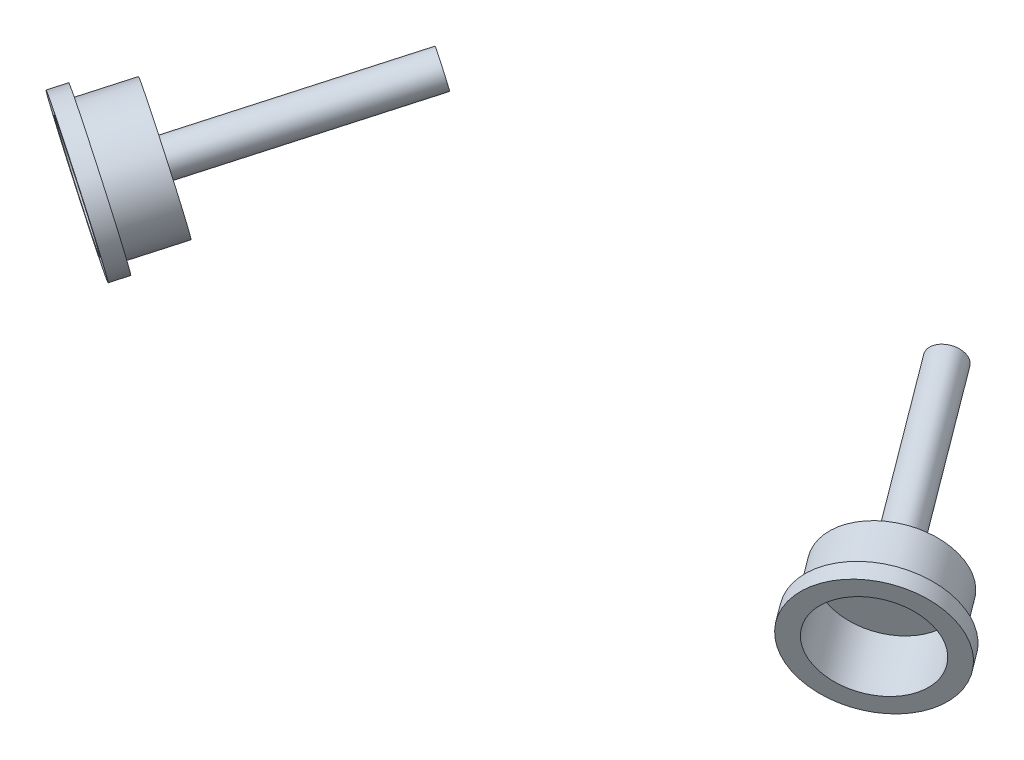
ISO-10303-21;
HEADER;
FILE_DESCRIPTION(('STEP AP214'),'2;1');
FILE_NAME('part.step','',(''),(''),'','','');
FILE_SCHEMA(('AUTOMOTIVE_DESIGN { 1 0 10303 214 1 1 1 1 }'));
ENDSEC;
DATA;
#1=APPLICATION_CONTEXT('core data for automotive mechanical design processes');
#2=APPLICATION_PROTOCOL_DEFINITION('international standard','automotive_design',2000,#1);
#3=PRODUCT_CONTEXT('',#1,'mechanical');
#4=PRODUCT('Part','Part','',(#3));
#5=PRODUCT_RELATED_PRODUCT_CATEGORY('part','',(#4));
#6=PRODUCT_DEFINITION_FORMATION('','',#4);
#7=PRODUCT_DEFINITION_CONTEXT('part definition',#1,'design');
#8=PRODUCT_DEFINITION('design','',#6,#7);
#9=PRODUCT_DEFINITION_SHAPE('','',#8);
#10=(LENGTH_UNIT() NAMED_UNIT(*) SI_UNIT(.MILLI.,.METRE.));
#11=(NAMED_UNIT(*) PLANE_ANGLE_UNIT() SI_UNIT($,.RADIAN.));
#12=(NAMED_UNIT(*) SI_UNIT($,.STERADIAN.) SOLID_ANGLE_UNIT());
#13=UNCERTAINTY_MEASURE_WITH_UNIT(LENGTH_MEASURE(1.E-05),#10,'distance_accuracy_value','');
#14=(GEOMETRIC_REPRESENTATION_CONTEXT(3) GLOBAL_UNCERTAINTY_ASSIGNED_CONTEXT((#13)) GLOBAL_UNIT_ASSIGNED_CONTEXT((#10,
#11,#12)) REPRESENTATION_CONTEXT('',''));
#15=CARTESIAN_POINT('',(0.,0.,0.));
#16=DIRECTION('',(0.,0.,1.));
#17=DIRECTION('',(1.,0.,0.));
#18=AXIS2_PLACEMENT_3D('',#15,#16,#17);
#19=CARTESIAN_POINT('',(7.09189110470637,-3.1747739557324,10.6212753890006));
#20=DIRECTION('',(0.538897500357627,-0.241244221560213,0.807087795516763));
#21=DIRECTION('',(-0.0886985432402282,0.936537053099896,0.339162080129877));
#22=AXIS2_PLACEMENT_3D('',#19,#20,#21);
#23=CYLINDRICAL_SURFACE('',#22,0.26);
#24=CARTESIAN_POINT('',(4.48901617797903,-2.00956436559657,6.72304133665464));
#25=DIRECTION('',(0.538897500357627,-0.241244221560213,0.807087795516763));
#26=DIRECTION('',(-0.0886985432402282,0.936537053099896,0.339162080129877));
#27=AXIS2_PLACEMENT_3D('',#24,#25,#26);
#28=CIRCLE('',#27,0.26);
#29=CARTESIAN_POINT('',(4.46595455673657,-1.7660647317906,6.8112234774884));
#30=VERTEX_POINT('',#29);
#31=EDGE_CURVE('P0_E10',#30,#30,#28,.T.);
#32=ORIENTED_EDGE('',*,*,#31,.F.);
#33=EDGE_LOOP('',(#32));
#34=FACE_BOUND('',#33,.T.);
#35=CARTESIAN_POINT('',(6.54221565434159,-2.92870484974099,9.79804583757351));
#36=DIRECTION('',(0.538897500357627,-0.241244221560213,0.807087795516763));
#37=DIRECTION('',(-0.0886985432402282,0.936537053099896,0.339162080129877));
#38=AXIS2_PLACEMENT_3D('',#35,#36,#37);
#39=CIRCLE('',#38,0.26);
#40=CARTESIAN_POINT('',(6.51915403309913,-2.68520521593501,9.88622797840727));
#41=VERTEX_POINT('',#40);
#42=EDGE_CURVE('P0_E49',#41,#41,#39,.T.);
#43=ORIENTED_EDGE('',*,*,#42,.T.);
#44=EDGE_LOOP('',(#43));
#45=FACE_BOUND('',#44,.T.);
#46=ADVANCED_FACE('P0_F15',(#34,#45),#23,.F.);
#47=CARTESIAN_POINT('',(4.51207779922149,-2.25306399940255,6.63485919582087));
#48=DIRECTION('',(0.538897500357627,-0.241244221560213,0.807087795516763));
#49=DIRECTION('',(-0.0886985432402282,0.936537053099896,0.339162080129877));
#50=AXIS2_PLACEMENT_3D('',#47,#48,#49);
#51=PLANE('',#50);
#52=CARTESIAN_POINT('',(4.48901617797903,-2.00956436559657,6.72304133665464));
#53=DIRECTION('',(0.538897500357627,-0.241244221560213,0.807087795516763));
#54=DIRECTION('',(-0.0886985432402282,0.936537053099896,0.339162080129877));
#55=AXIS2_PLACEMENT_3D('',#52,#53,#54);
#56=CIRCLE('',#55,0.3);
#57=CARTESIAN_POINT('',(4.46240661500696,-1.72860324966661,6.8247899606936));
#58=VERTEX_POINT('',#57);
#59=EDGE_CURVE('P0_E21',#58,#58,#56,.T.);
#60=ORIENTED_EDGE('',*,*,#59,.F.);
#61=EDGE_LOOP('',(#60));
#62=FACE_BOUND('',#61,.T.);
#63=ORIENTED_EDGE('',*,*,#31,.T.);
#64=EDGE_LOOP('',(#63));
#65=FACE_BOUND('',#64,.T.);
#66=ADVANCED_FACE('P0_F98',(#62,#65),#51,.F.);
#67=CARTESIAN_POINT('',(7.09189110470637,-3.1747739557324,10.6212753890006));
#68=DIRECTION('',(0.538897500357627,-0.241244221560213,0.807087795516763));
#69=DIRECTION('',(-0.0886985432402282,0.936537053099896,0.339162080129877));
#70=AXIS2_PLACEMENT_3D('',#67,#68,#69);
#71=CYLINDRICAL_SURFACE('',#70,0.3);
#72=CARTESIAN_POINT('',(6.46677000429152,-2.89493065872256,9.68505354620116));
#73=DIRECTION('',(0.538897500357627,-0.241244221560213,0.807087795516763));
#74=DIRECTION('',(-0.0886985432402282,0.936537053099896,0.339162080129877));
#75=AXIS2_PLACEMENT_3D('',#72,#73,#74);
#76=CIRCLE('',#75,0.3);
#77=CARTESIAN_POINT('',(6.44016044131945,-2.61396954279259,9.78680217024012));
#78=VERTEX_POINT('',#77);
#79=EDGE_CURVE('P0_E25',#78,#78,#76,.T.);
#80=ORIENTED_EDGE('',*,*,#79,.F.);
#81=EDGE_LOOP('',(#80));
#82=FACE_BOUND('',#81,.T.);
#83=ORIENTED_EDGE('',*,*,#59,.T.);
#84=EDGE_LOOP('',(#83));
#85=FACE_BOUND('',#84,.T.);
#86=ADVANCED_FACE('P0_F93',(#82,#85),#71,.T.);
#87=CARTESIAN_POINT('',(6.49337956726359,-3.17589177465252,9.5833049221622));
#88=DIRECTION('',(0.538897500357627,-0.241244221560213,0.807087795516763));
#89=DIRECTION('',(-0.0886985432402282,0.936537053099896,0.339162080129877));
#90=AXIS2_PLACEMENT_3D('',#87,#88,#89);
#91=PLANE('',#90);
#92=CARTESIAN_POINT('',(6.46677000429152,-2.89493065872256,9.68505354620116));
#93=DIRECTION('',(0.538897500357627,-0.241244221560213,0.807087795516763));
#94=DIRECTION('',(-0.0886985432402282,0.936537053099896,0.339162080129877));
#95=AXIS2_PLACEMENT_3D('',#92,#93,#94);
#96=CIRCLE('',#95,1.08);
#97=CARTESIAN_POINT('',(6.37097557759207,-1.88347064137467,10.0513485927414));
#98=VERTEX_POINT('',#97);
#99=EDGE_CURVE('P0_E29',#98,#98,#96,.T.);
#100=ORIENTED_EDGE('',*,*,#99,.F.);
#101=EDGE_LOOP('',(#100));
#102=FACE_BOUND('',#101,.T.);
#103=ORIENTED_EDGE('',*,*,#79,.T.);
#104=EDGE_LOOP('',(#103));
#105=FACE_BOUND('',#104,.T.);
#106=ADVANCED_FACE('P0_F87',(#102,#105),#91,.F.);
#107=CARTESIAN_POINT('',(7.09189110470637,-3.1747739557324,10.6212753890006));
#108=DIRECTION('',(0.538897500357627,-0.241244221560213,0.807087795516763));
#109=DIRECTION('',(-0.0886985432402282,0.936537053099896,0.339162080129877));
#110=AXIS2_PLACEMENT_3D('',#107,#108,#109);
#111=CYLINDRICAL_SURFACE('',#110,1.08);
#112=CARTESIAN_POINT('',(6.93022185459908,-3.10240068926434,10.3791490503456));
#113=DIRECTION('',(0.538897500357627,-0.241244221560213,0.807087795516763));
#114=DIRECTION('',(-0.0886985432402282,0.936537053099896,0.339162080129877));
#115=AXIS2_PLACEMENT_3D('',#112,#113,#114);
#116=CIRCLE('',#115,1.08);
#117=CARTESIAN_POINT('',(6.83442742789963,-2.09094067191645,10.7454440968858));
#118=VERTEX_POINT('',#117);
#119=EDGE_CURVE('P0_E34',#118,#118,#116,.T.);
#120=ORIENTED_EDGE('',*,*,#119,.F.);
#121=EDGE_LOOP('',(#120));
#122=FACE_BOUND('',#121,.T.);
#123=ORIENTED_EDGE('',*,*,#99,.T.);
#124=EDGE_LOOP('',(#123));
#125=FACE_BOUND('',#124,.T.);
#126=ADVANCED_FACE('P0_F81',(#122,#125),#111,.T.);
#127=CARTESIAN_POINT('',(7.02601628129853,-4.11386070661223,10.0128540038053));
#128=DIRECTION('',(0.538897500357627,-0.241244221560213,0.807087795516763));
#129=DIRECTION('',(-0.0886985432402282,0.936537053099896,0.339162080129877));
#130=AXIS2_PLACEMENT_3D('',#127,#128,#129);
#131=PLANE('',#130);
#132=CARTESIAN_POINT('',(6.93022185459908,-3.10240068926434,10.3791490503456));
#133=DIRECTION('',(0.538897500357627,-0.241244221560213,0.807087795516763));
#134=DIRECTION('',(-0.0886985432402282,0.936537053099896,0.339162080129877));
#135=AXIS2_PLACEMENT_3D('',#132,#133,#134);
#136=CIRCLE('',#135,1.275);
#137=CARTESIAN_POINT('',(6.81713121196779,-1.90831594656197,10.8115807025112));
#138=VERTEX_POINT('',#137);
#139=EDGE_CURVE('P0_E37',#138,#138,#136,.T.);
#140=ORIENTED_EDGE('',*,*,#139,.F.);
#141=EDGE_LOOP('',(#140));
#142=FACE_BOUND('',#141,.T.);
#143=ORIENTED_EDGE('',*,*,#119,.T.);
#144=EDGE_LOOP('',(#143));
#145=FACE_BOUND('',#144,.T.);
#146=ADVANCED_FACE('P0_F75',(#142,#145),#131,.F.);
#147=CARTESIAN_POINT('',(7.09189110470637,-3.1747739557324,10.6212753890006));
#148=DIRECTION('',(0.538897500357627,-0.241244221560213,0.807087795516763));
#149=DIRECTION('',(-0.0886985432402282,0.936537053099896,0.339162080129877));
#150=AXIS2_PLACEMENT_3D('',#147,#148,#149);
#151=CYLINDRICAL_SURFACE('',#150,1.275);
#152=CARTESIAN_POINT('',(7.09189110470637,-3.1747739557324,10.6212753890006));
#153=DIRECTION('',(0.538897500357627,-0.241244221560213,0.807087795516763));
#154=DIRECTION('',(-0.0886985432402282,0.936537053099896,0.339162080129877));
#155=AXIS2_PLACEMENT_3D('',#152,#153,#154);
#156=CIRCLE('',#155,1.275);
#157=CARTESIAN_POINT('',(6.97880046207508,-1.98068921303004,11.0537070411662));
#158=VERTEX_POINT('',#157);
#159=EDGE_CURVE('P0_E40',#158,#158,#156,.T.);
#160=ORIENTED_EDGE('',*,*,#159,.F.);
#161=EDGE_LOOP('',(#160));
#162=FACE_BOUND('',#161,.T.);
#163=ORIENTED_EDGE('',*,*,#139,.T.);
#164=EDGE_LOOP('',(#163));
#165=FACE_BOUND('',#164,.T.);
#166=ADVANCED_FACE('P0_F69',(#162,#165),#151,.T.);
#167=CARTESIAN_POINT('',(7.20498174733766,-4.36885869843477,10.188843736835));
#168=DIRECTION('',(-0.538897500357627,0.241244221560213,-0.807087795516763));
#169=DIRECTION('',(0.0886985432402282,-0.936537053099896,-0.339162080129877));
#170=AXIS2_PLACEMENT_3D('',#167,#168,#169);
#171=PLANE('',#170);
#172=CARTESIAN_POINT('',(7.09189110470637,-3.1747739557324,10.6212753890006));
#173=DIRECTION('',(0.538897500357627,-0.241244221560213,0.807087795516763));
#174=DIRECTION('',(-0.0886985432402282,0.936537053099896,0.339162080129877));
#175=AXIS2_PLACEMENT_3D('',#172,#173,#174);
#176=CIRCLE('',#175,0.945);
#177=CARTESIAN_POINT('',(7.00807098134435,-2.289746440553,10.9417835547233));
#178=VERTEX_POINT('',#177);
#179=EDGE_CURVE('P0_E43',#178,#178,#176,.T.);
#180=ORIENTED_EDGE('',*,*,#179,.F.);
#181=EDGE_LOOP('',(#180));
#182=FACE_BOUND('',#181,.T.);
#183=ORIENTED_EDGE('',*,*,#159,.T.);
#184=EDGE_LOOP('',(#183));
#185=FACE_BOUND('',#184,.T.);
#186=ADVANCED_FACE('P0_F63',(#182,#185),#171,.F.);
#187=CARTESIAN_POINT('',(7.09189110470637,-3.1747739557324,10.6212753890006));
#188=DIRECTION('',(0.538897500357627,-0.241244221560213,0.807087795516763));
#189=DIRECTION('',(-0.0886985432402282,0.936537053099896,0.339162080129877));
#190=AXIS2_PLACEMENT_3D('',#187,#188,#189);
#191=CYLINDRICAL_SURFACE('',#190,0.945);
#192=CARTESIAN_POINT('',(6.54221565434159,-2.92870484974099,9.79804583757351));
#193=DIRECTION('',(0.538897500357627,-0.241244221560213,0.807087795516763));
#194=DIRECTION('',(-0.0886985432402282,0.936537053099896,0.339162080129877));
#195=AXIS2_PLACEMENT_3D('',#192,#193,#194);
#196=CIRCLE('',#195,0.945);
#197=CARTESIAN_POINT('',(6.45839553097957,-2.04367733456158,10.1185540032962));
#198=VERTEX_POINT('',#197);
#199=EDGE_CURVE('P0_E46',#198,#198,#196,.T.);
#200=ORIENTED_EDGE('',*,*,#199,.F.);
#201=EDGE_LOOP('',(#200));
#202=FACE_BOUND('',#201,.T.);
#203=ORIENTED_EDGE('',*,*,#179,.T.);
#204=EDGE_LOOP('',(#203));
#205=FACE_BOUND('',#204,.T.);
#206=ADVANCED_FACE('P0_F57',(#202,#205),#191,.F.);
#207=CARTESIAN_POINT('',(6.6260357777036,-3.81373236492039,9.47753767185077));
#208=DIRECTION('',(-0.538897500357627,0.241244221560213,-0.807087795516763));
#209=DIRECTION('',(0.0886985432402282,-0.936537053099896,-0.339162080129877));
#210=AXIS2_PLACEMENT_3D('',#207,#208,#209);
#211=PLANE('',#210);
#212=ORIENTED_EDGE('',*,*,#42,.F.);
#213=EDGE_LOOP('',(#212));
#214=FACE_BOUND('',#213,.T.);
#215=ORIENTED_EDGE('',*,*,#199,.T.);
#216=EDGE_LOOP('',(#215));
#217=FACE_BOUND('',#216,.T.);
#218=ADVANCED_FACE('P0_F54',(#214,#217),#211,.F.);
#219=CLOSED_SHELL('',(#46,#66,#86,#106,#126,#146,#166,#186,#206,#218));
#220=MANIFOLD_SOLID_BREP('P0_B1',#219);
#221=CARTESIAN_POINT('',(-7.09189110470637,-3.1747739557324,10.6212753890006));
#222=DIRECTION('',(-0.538897500357627,-0.241244221560212,0.807087795516763));
#223=DIRECTION('',(-0.234853213870572,-0.877095865970433,-0.418983066283401));
#224=AXIS2_PLACEMENT_3D('',#221,#222,#223);
#225=CYLINDRICAL_SURFACE('',#224,0.26);
#226=CARTESIAN_POINT('',(-4.48901617797903,-2.00956436559657,6.72304133665463));
#227=DIRECTION('',(-0.538897500357627,-0.241244221560212,0.807087795516763));
#228=DIRECTION('',(-0.234853213870572,-0.877095865970433,-0.418983066283401));
#229=AXIS2_PLACEMENT_3D('',#226,#227,#228);
#230=CIRCLE('',#229,0.26);
#231=CARTESIAN_POINT('',(-4.55007801358537,-2.23760929074889,6.61410573942095));
#232=VERTEX_POINT('',#231);
#233=EDGE_CURVE('P1_E9',#232,#232,#230,.T.);
#234=ORIENTED_EDGE('',*,*,#233,.F.);
#235=EDGE_LOOP('',(#234));
#236=FACE_BOUND('',#235,.T.);
#237=CARTESIAN_POINT('',(-6.54221565434159,-2.92870484974098,9.7980458375735));
#238=DIRECTION('',(-0.538897500357627,-0.241244221560212,0.807087795516763));
#239=DIRECTION('',(-0.234853213870572,-0.877095865970433,-0.418983066283401));
#240=AXIS2_PLACEMENT_3D('',#237,#238,#239);
#241=CIRCLE('',#240,0.26);
#242=CARTESIAN_POINT('',(-6.60327748994793,-3.15674977489329,9.68911024033982));
#243=VERTEX_POINT('',#242);
#244=EDGE_CURVE('P1_E48',#243,#243,#241,.T.);
#245=ORIENTED_EDGE('',*,*,#244,.T.);
#246=EDGE_LOOP('',(#245));
#247=FACE_BOUND('',#246,.T.);
#248=ADVANCED_FACE('P1_F14',(#236,#247),#225,.F.);
#249=CARTESIAN_POINT('',(-4.42795434237268,-1.78151944044426,6.83197693388832));
#250=DIRECTION('',(-0.538897500357627,-0.241244221560212,0.807087795516763));
#251=DIRECTION('',(-0.234853213870572,-0.877095865970433,-0.418983066283401));
#252=AXIS2_PLACEMENT_3D('',#249,#250,#251);
#253=PLANE('',#252);
#254=CARTESIAN_POINT('',(-4.48901617797903,-2.00956436559657,6.72304133665463));
#255=DIRECTION('',(-0.538897500357627,-0.241244221560212,0.807087795516763));
#256=DIRECTION('',(-0.234853213870572,-0.877095865970433,-0.418983066283401));
#257=AXIS2_PLACEMENT_3D('',#254,#255,#256);
#258=CIRCLE('',#257,0.3);
#259=CARTESIAN_POINT('',(-4.5594721421402,-2.2726931253877,6.59734641676961));
#260=VERTEX_POINT('',#259);
#261=EDGE_CURVE('P1_E20',#260,#260,#258,.T.);
#262=ORIENTED_EDGE('',*,*,#261,.F.);
#263=EDGE_LOOP('',(#262));
#264=FACE_BOUND('',#263,.T.);
#265=ORIENTED_EDGE('',*,*,#233,.T.);
#266=EDGE_LOOP('',(#265));
#267=FACE_BOUND('',#266,.T.);
#268=ADVANCED_FACE('P1_F97',(#264,#267),#253,.F.);
#269=CARTESIAN_POINT('',(-7.09189110470637,-3.1747739557324,10.6212753890006));
#270=DIRECTION('',(-0.538897500357627,-0.241244221560212,0.807087795516763));
#271=DIRECTION('',(-0.234853213870572,-0.877095865970433,-0.418983066283401));
#272=AXIS2_PLACEMENT_3D('',#269,#270,#271);
#273=CYLINDRICAL_SURFACE('',#272,0.3);
#274=CARTESIAN_POINT('',(-6.46677000429152,-2.89493065872255,9.68505354620116));
#275=DIRECTION('',(-0.538897500357627,-0.241244221560212,0.807087795516763));
#276=DIRECTION('',(-0.234853213870572,-0.877095865970433,-0.418983066283401));
#277=AXIS2_PLACEMENT_3D('',#274,#275,#276);
#278=CIRCLE('',#277,0.3);
#279=CARTESIAN_POINT('',(-6.53722596845269,-3.15805941851368,9.55935862631613));
#280=VERTEX_POINT('',#279);
#281=EDGE_CURVE('P1_E24',#280,#280,#278,.T.);
#282=ORIENTED_EDGE('',*,*,#281,.F.);
#283=EDGE_LOOP('',(#282));
#284=FACE_BOUND('',#283,.T.);
#285=ORIENTED_EDGE('',*,*,#261,.T.);
#286=EDGE_LOOP('',(#285));
#287=FACE_BOUND('',#286,.T.);
#288=ADVANCED_FACE('P1_F92',(#284,#287),#273,.T.);
#289=CARTESIAN_POINT('',(-6.39631404013035,-2.63180189893142,9.81074846608617));
#290=DIRECTION('',(-0.538897500357627,-0.241244221560212,0.807087795516763));
#291=DIRECTION('',(-0.234853213870572,-0.877095865970433,-0.418983066283401));
#292=AXIS2_PLACEMENT_3D('',#289,#290,#291);
#293=PLANE('',#292);
#294=CARTESIAN_POINT('',(-6.46677000429152,-2.89493065872255,9.68505354620116));
#295=DIRECTION('',(-0.538897500357627,-0.241244221560212,0.807087795516763));
#296=DIRECTION('',(-0.234853213870572,-0.877095865970433,-0.418983066283401));
#297=AXIS2_PLACEMENT_3D('',#294,#295,#296);
#298=CIRCLE('',#297,1.08);
#299=CARTESIAN_POINT('',(-6.72041147527174,-3.84219419397062,9.23255183461508));
#300=VERTEX_POINT('',#299);
#301=EDGE_CURVE('P1_E28',#300,#300,#298,.T.);
#302=ORIENTED_EDGE('',*,*,#301,.F.);
#303=EDGE_LOOP('',(#302));
#304=FACE_BOUND('',#303,.T.);
#305=ORIENTED_EDGE('',*,*,#281,.T.);
#306=EDGE_LOOP('',(#305));
#307=FACE_BOUND('',#306,.T.);
#308=ADVANCED_FACE('P1_F86',(#304,#307),#293,.F.);
#309=CARTESIAN_POINT('',(-7.09189110470637,-3.1747739557324,10.6212753890006));
#310=DIRECTION('',(-0.538897500357627,-0.241244221560212,0.807087795516763));
#311=DIRECTION('',(-0.234853213870572,-0.877095865970433,-0.418983066283401));
#312=AXIS2_PLACEMENT_3D('',#309,#310,#311);
#313=CYLINDRICAL_SURFACE('',#312,1.08);
#314=CARTESIAN_POINT('',(-6.93022185459908,-3.10240068926433,10.3791490503456));
#315=DIRECTION('',(-0.538897500357627,-0.241244221560212,0.807087795516763));
#316=DIRECTION('',(-0.234853213870572,-0.877095865970433,-0.418983066283401));
#317=AXIS2_PLACEMENT_3D('',#314,#315,#316);
#318=CIRCLE('',#317,1.08);
#319=CARTESIAN_POINT('',(-7.1838633255793,-4.0496642245124,9.9266473387595));
#320=VERTEX_POINT('',#319);
#321=EDGE_CURVE('P1_E33',#320,#320,#318,.T.);
#322=ORIENTED_EDGE('',*,*,#321,.F.);
#323=EDGE_LOOP('',(#322));
#324=FACE_BOUND('',#323,.T.);
#325=ORIENTED_EDGE('',*,*,#301,.T.);
#326=EDGE_LOOP('',(#325));
#327=FACE_BOUND('',#326,.T.);
#328=ADVANCED_FACE('P1_F80',(#324,#327),#313,.T.);
#329=CARTESIAN_POINT('',(-6.67658038361886,-2.15513715401627,10.8316507619316));
#330=DIRECTION('',(-0.538897500357627,-0.241244221560212,0.807087795516763));
#331=DIRECTION('',(-0.234853213870572,-0.877095865970433,-0.418983066283401));
#332=AXIS2_PLACEMENT_3D('',#329,#330,#331);
#333=PLANE('',#332);
#334=CARTESIAN_POINT('',(-6.93022185459908,-3.10240068926433,10.3791490503456));
#335=DIRECTION('',(-0.538897500357627,-0.241244221560212,0.807087795516763));
#336=DIRECTION('',(-0.234853213870572,-0.877095865970433,-0.418983066283401));
#337=AXIS2_PLACEMENT_3D('',#334,#335,#336);
#338=CIRCLE('',#337,1.275);
#339=CARTESIAN_POINT('',(-7.22965970228406,-4.22069791837664,9.84494564083423));
#340=VERTEX_POINT('',#339);
#341=EDGE_CURVE('P1_E36',#340,#340,#338,.T.);
#342=ORIENTED_EDGE('',*,*,#341,.F.);
#343=EDGE_LOOP('',(#342));
#344=FACE_BOUND('',#343,.T.);
#345=ORIENTED_EDGE('',*,*,#321,.T.);
#346=EDGE_LOOP('',(#345));
#347=FACE_BOUND('',#346,.T.);
#348=ADVANCED_FACE('P1_F74',(#344,#347),#333,.F.);
#349=CARTESIAN_POINT('',(-7.09189110470637,-3.1747739557324,10.6212753890006));
#350=DIRECTION('',(-0.538897500357627,-0.241244221560212,0.807087795516763));
#351=DIRECTION('',(-0.234853213870572,-0.877095865970433,-0.418983066283401));
#352=AXIS2_PLACEMENT_3D('',#349,#350,#351);
#353=CYLINDRICAL_SURFACE('',#352,1.275);
#354=CARTESIAN_POINT('',(-7.09189110470637,-3.1747739557324,10.6212753890006));
#355=DIRECTION('',(-0.538897500357627,-0.241244221560212,0.807087795516763));
#356=DIRECTION('',(-0.234853213870572,-0.877095865970433,-0.418983066283401));
#357=AXIS2_PLACEMENT_3D('',#354,#355,#356);
#358=CIRCLE('',#357,1.275);
#359=CARTESIAN_POINT('',(-7.39132895239135,-4.2930711848447,10.0870719794893));
#360=VERTEX_POINT('',#359);
#361=EDGE_CURVE('P1_E39',#360,#360,#358,.T.);
#362=ORIENTED_EDGE('',*,*,#361,.F.);
#363=EDGE_LOOP('',(#362));
#364=FACE_BOUND('',#363,.T.);
#365=ORIENTED_EDGE('',*,*,#341,.T.);
#366=EDGE_LOOP('',(#365));
#367=FACE_BOUND('',#366,.T.);
#368=ADVANCED_FACE('P1_F68',(#364,#367),#353,.T.);
#369=CARTESIAN_POINT('',(-6.79245325702139,-2.0564767266201,11.1554787985119));
#370=DIRECTION('',(0.538897500357627,0.241244221560212,-0.807087795516763));
#371=DIRECTION('',(0.234853213870572,0.877095865970433,0.418983066283401));
#372=AXIS2_PLACEMENT_3D('',#369,#370,#371);
#373=PLANE('',#372);
#374=CARTESIAN_POINT('',(-7.09189110470637,-3.1747739557324,10.6212753890006));
#375=DIRECTION('',(-0.538897500357627,-0.241244221560212,0.807087795516763));
#376=DIRECTION('',(-0.234853213870572,-0.877095865970433,-0.418983066283401));
#377=AXIS2_PLACEMENT_3D('',#374,#375,#376);
#378=CIRCLE('',#377,0.945);
#379=CARTESIAN_POINT('',(-7.31382739181406,-4.00362954907446,10.2253363913628));
#380=VERTEX_POINT('',#379);
#381=EDGE_CURVE('P1_E42',#380,#380,#378,.T.);
#382=ORIENTED_EDGE('',*,*,#381,.F.);
#383=EDGE_LOOP('',(#382));
#384=FACE_BOUND('',#383,.T.);
#385=ORIENTED_EDGE('',*,*,#361,.T.);
#386=EDGE_LOOP('',(#385));
#387=FACE_BOUND('',#386,.T.);
#388=ADVANCED_FACE('P1_F62',(#384,#387),#373,.F.);
#389=CARTESIAN_POINT('',(-7.09189110470637,-3.1747739557324,10.6212753890006));
#390=DIRECTION('',(-0.538897500357627,-0.241244221560212,0.807087795516763));
#391=DIRECTION('',(-0.234853213870572,-0.877095865970433,-0.418983066283401));
#392=AXIS2_PLACEMENT_3D('',#389,#390,#391);
#393=CYLINDRICAL_SURFACE('',#392,0.945);
#394=CARTESIAN_POINT('',(-6.54221565434159,-2.92870484974098,9.7980458375735));
#395=DIRECTION('',(-0.538897500357627,-0.241244221560212,0.807087795516763));
#396=DIRECTION('',(-0.234853213870572,-0.877095865970433,-0.418983066283401));
#397=AXIS2_PLACEMENT_3D('',#394,#395,#396);
#398=CIRCLE('',#397,0.945);
#399=CARTESIAN_POINT('',(-6.76415194144928,-3.75756044308304,9.40210683993569));
#400=VERTEX_POINT('',#399);
#401=EDGE_CURVE('P1_E45',#400,#400,#398,.T.);
#402=ORIENTED_EDGE('',*,*,#401,.F.);
#403=EDGE_LOOP('',(#402));
#404=FACE_BOUND('',#403,.T.);
#405=ORIENTED_EDGE('',*,*,#381,.T.);
#406=EDGE_LOOP('',(#405));
#407=FACE_BOUND('',#406,.T.);
#408=ADVANCED_FACE('P1_F56',(#404,#407),#393,.F.);
#409=CARTESIAN_POINT('',(-6.3202793672339,-2.09984925639892,10.1939848352113));
#410=DIRECTION('',(0.538897500357627,0.241244221560212,-0.807087795516763));
#411=DIRECTION('',(0.234853213870572,0.877095865970433,0.418983066283401));
#412=AXIS2_PLACEMENT_3D('',#409,#410,#411);
#413=PLANE('',#412);
#414=ORIENTED_EDGE('',*,*,#244,.F.);
#415=EDGE_LOOP('',(#414));
#416=FACE_BOUND('',#415,.T.);
#417=ORIENTED_EDGE('',*,*,#401,.T.);
#418=EDGE_LOOP('',(#417));
#419=FACE_BOUND('',#418,.T.);
#420=ADVANCED_FACE('P1_F53',(#416,#419),#413,.F.);
#421=CLOSED_SHELL('',(#248,#268,#288,#308,#328,#348,#368,#388,#408,#420));
#422=MANIFOLD_SOLID_BREP('P1_B1',#421);
#423=ADVANCED_BREP_SHAPE_REPRESENTATION('',(#18,#220,#422),#14);
#424=SHAPE_DEFINITION_REPRESENTATION(#9,#423);
ENDSEC;
END-ISO-10303-21;
